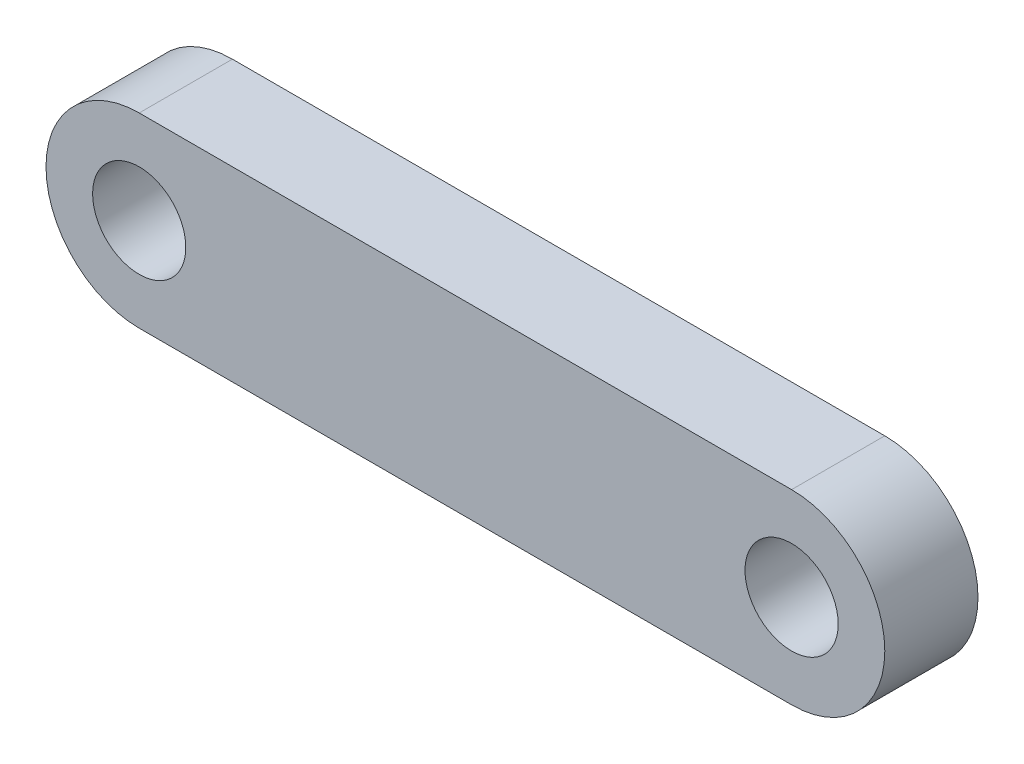
ISO-10303-21;
HEADER;
FILE_DESCRIPTION(('STEP AP214'),'2;1');
FILE_NAME('part.step','',(''),(''),'','','');
FILE_SCHEMA(('AUTOMOTIVE_DESIGN { 1 0 10303 214 1 1 1 1 }'));
ENDSEC;
DATA;
#1=APPLICATION_CONTEXT('core data for automotive mechanical design processes');
#2=APPLICATION_PROTOCOL_DEFINITION('international standard','automotive_design',2000,#1);
#3=PRODUCT_CONTEXT('',#1,'mechanical');
#4=PRODUCT('Part','Part','',(#3));
#5=PRODUCT_RELATED_PRODUCT_CATEGORY('part','',(#4));
#6=PRODUCT_DEFINITION_FORMATION('','',#4);
#7=PRODUCT_DEFINITION_CONTEXT('part definition',#1,'design');
#8=PRODUCT_DEFINITION('design','',#6,#7);
#9=PRODUCT_DEFINITION_SHAPE('','',#8);
#10=(LENGTH_UNIT() NAMED_UNIT(*) SI_UNIT(.MILLI.,.METRE.));
#11=(NAMED_UNIT(*) PLANE_ANGLE_UNIT() SI_UNIT($,.RADIAN.));
#12=(NAMED_UNIT(*) SI_UNIT($,.STERADIAN.) SOLID_ANGLE_UNIT());
#13=UNCERTAINTY_MEASURE_WITH_UNIT(LENGTH_MEASURE(1.E-05),#10,'distance_accuracy_value','');
#14=(GEOMETRIC_REPRESENTATION_CONTEXT(3) GLOBAL_UNCERTAINTY_ASSIGNED_CONTEXT((#13)) GLOBAL_UNIT_ASSIGNED_CONTEXT((#10,
#11,#12)) REPRESENTATION_CONTEXT('',''));
#15=CARTESIAN_POINT('',(0.,0.,0.));
#16=DIRECTION('',(0.,0.,1.));
#17=DIRECTION('',(1.,0.,0.));
#18=AXIS2_PLACEMENT_3D('',#15,#16,#17);
#19=CARTESIAN_POINT('',(-35.,0.,10.));
#20=DIRECTION('',(0.,0.,1.));
#21=DIRECTION('',(1.,0.,0.));
#22=AXIS2_PLACEMENT_3D('',#19,#20,#21);
#23=PLANE('',#22);
#24=CARTESIAN_POINT('',(35.,0.,10.));
#25=DIRECTION('',(0.,0.,1.));
#26=DIRECTION('',(1.,0.,0.));
#27=AXIS2_PLACEMENT_3D('',#24,#25,#26);
#28=CIRCLE('',#27,5.);
#29=CARTESIAN_POINT('',(40.,0.,10.));
#30=VERTEX_POINT('',#29);
#31=EDGE_CURVE('E100',#30,#30,#28,.T.);
#32=ORIENTED_EDGE('',*,*,#31,.F.);
#33=EDGE_LOOP('',(#32));
#34=FACE_BOUND('',#33,.T.);
#35=CARTESIAN_POINT('',(-35.,0.,10.));
#36=DIRECTION('',(0.,0.,1.));
#37=DIRECTION('',(1.,0.,0.));
#38=AXIS2_PLACEMENT_3D('',#35,#36,#37);
#39=CIRCLE('',#38,10.);
#40=CARTESIAN_POINT('',(-35.,10.,10.));
#41=VERTEX_POINT('',#40);
#42=CARTESIAN_POINT('',(-35.,-10.,10.));
#43=VERTEX_POINT('',#42);
#44=EDGE_CURVE('E85',#41,#43,#39,.T.);
#45=ORIENTED_EDGE('',*,*,#44,.T.);
#46=DIRECTION('',(1.,0.,0.));
#47=VECTOR('',#46,1.);
#48=CARTESIAN_POINT('',(-35.,-10.,10.));
#49=LINE('',#48,#47);
#50=CARTESIAN_POINT('',(35.,-10.,10.));
#51=VERTEX_POINT('',#50);
#52=EDGE_CURVE('E80',#43,#51,#49,.T.);
#53=ORIENTED_EDGE('',*,*,#52,.T.);
#54=CARTESIAN_POINT('',(35.,0.,10.));
#55=DIRECTION('',(0.,0.,1.));
#56=DIRECTION('',(1.,0.,0.));
#57=AXIS2_PLACEMENT_3D('',#54,#55,#56);
#58=CIRCLE('',#57,10.);
#59=CARTESIAN_POINT('',(35.,10.,10.));
#60=VERTEX_POINT('',#59);
#61=EDGE_CURVE('E83',#51,#60,#58,.T.);
#62=ORIENTED_EDGE('',*,*,#61,.T.);
#63=DIRECTION('',(-1.,0.,0.));
#64=VECTOR('',#63,1.);
#65=CARTESIAN_POINT('',(-35.,10.,10.));
#66=LINE('',#65,#64);
#67=EDGE_CURVE('E50',#60,#41,#66,.T.);
#68=ORIENTED_EDGE('',*,*,#67,.T.);
#69=EDGE_LOOP('',(#45,#53,#62,#68));
#70=FACE_BOUND('',#69,.T.);
#71=CARTESIAN_POINT('',(-35.,0.,10.));
#72=DIRECTION('',(0.,0.,1.));
#73=DIRECTION('',(-1.,0.,0.));
#74=AXIS2_PLACEMENT_3D('',#71,#72,#73);
#75=CIRCLE('',#74,5.);
#76=CARTESIAN_POINT('',(-40.,0.,10.));
#77=VERTEX_POINT('',#76);
#78=EDGE_CURVE('E115',#77,#77,#75,.T.);
#79=ORIENTED_EDGE('',*,*,#78,.F.);
#80=EDGE_LOOP('',(#79));
#81=FACE_BOUND('',#80,.T.);
#82=ADVANCED_FACE('F33',(#34,#70,#81),#23,.T.);
#83=CARTESIAN_POINT('',(-35.,0.,0.));
#84=DIRECTION('',(0.,0.,1.));
#85=DIRECTION('',(1.,0.,0.));
#86=AXIS2_PLACEMENT_3D('',#83,#84,#85);
#87=PLANE('',#86);
#88=CARTESIAN_POINT('',(-35.,0.,0.));
#89=DIRECTION('',(0.,0.,1.));
#90=DIRECTION('',(1.,0.,0.));
#91=AXIS2_PLACEMENT_3D('',#88,#89,#90);
#92=CIRCLE('',#91,10.);
#93=CARTESIAN_POINT('',(-35.,10.,0.));
#94=VERTEX_POINT('',#93);
#95=CARTESIAN_POINT('',(-35.,-10.,0.));
#96=VERTEX_POINT('',#95);
#97=EDGE_CURVE('E97',#94,#96,#92,.T.);
#98=ORIENTED_EDGE('',*,*,#97,.F.);
#99=DIRECTION('',(-1.,0.,0.));
#100=VECTOR('',#99,1.);
#101=CARTESIAN_POINT('',(-35.,10.,0.));
#102=LINE('',#101,#100);
#103=CARTESIAN_POINT('',(35.,10.,0.));
#104=VERTEX_POINT('',#103);
#105=EDGE_CURVE('E73',#104,#94,#102,.T.);
#106=ORIENTED_EDGE('',*,*,#105,.F.);
#107=CARTESIAN_POINT('',(35.,0.,0.));
#108=DIRECTION('',(0.,0.,1.));
#109=DIRECTION('',(1.,0.,0.));
#110=AXIS2_PLACEMENT_3D('',#107,#108,#109);
#111=CIRCLE('',#110,10.);
#112=CARTESIAN_POINT('',(35.,-10.,0.));
#113=VERTEX_POINT('',#112);
#114=EDGE_CURVE('E67',#113,#104,#111,.T.);
#115=ORIENTED_EDGE('',*,*,#114,.F.);
#116=DIRECTION('',(1.,0.,0.));
#117=VECTOR('',#116,1.);
#118=CARTESIAN_POINT('',(-35.,-10.,0.));
#119=LINE('',#118,#117);
#120=EDGE_CURVE('E89',#96,#113,#119,.T.);
#121=ORIENTED_EDGE('',*,*,#120,.F.);
#122=EDGE_LOOP('',(#98,#106,#115,#121));
#123=FACE_BOUND('',#122,.T.);
#124=CARTESIAN_POINT('',(35.,0.,0.));
#125=DIRECTION('',(0.,0.,1.));
#126=DIRECTION('',(1.,0.,0.));
#127=AXIS2_PLACEMENT_3D('',#124,#125,#126);
#128=CIRCLE('',#127,5.);
#129=CARTESIAN_POINT('',(40.,0.,0.));
#130=VERTEX_POINT('',#129);
#131=EDGE_CURVE('E112',#130,#130,#128,.T.);
#132=ORIENTED_EDGE('',*,*,#131,.T.);
#133=EDGE_LOOP('',(#132));
#134=FACE_BOUND('',#133,.T.);
#135=CARTESIAN_POINT('',(-35.,0.,0.));
#136=DIRECTION('',(0.,0.,1.));
#137=DIRECTION('',(-1.,0.,0.));
#138=AXIS2_PLACEMENT_3D('',#135,#136,#137);
#139=CIRCLE('',#138,5.);
#140=CARTESIAN_POINT('',(-40.,0.,0.));
#141=VERTEX_POINT('',#140);
#142=EDGE_CURVE('E118',#141,#141,#139,.T.);
#143=ORIENTED_EDGE('',*,*,#142,.T.);
#144=EDGE_LOOP('',(#143));
#145=FACE_BOUND('',#144,.T.);
#146=ADVANCED_FACE('F108',(#123,#134,#145),#87,.F.);
#147=CARTESIAN_POINT('',(-35.,0.,10.));
#148=DIRECTION('',(0.,0.,-1.));
#149=DIRECTION('',(-1.,0.,0.));
#150=AXIS2_PLACEMENT_3D('',#147,#148,#149);
#151=CYLINDRICAL_SURFACE('',#150,10.);
#152=ORIENTED_EDGE('',*,*,#97,.T.);
#153=DIRECTION('',(0.,0.,-1.));
#154=VECTOR('',#153,1.);
#155=CARTESIAN_POINT('',(-35.,-10.,10.));
#156=LINE('',#155,#154);
#157=EDGE_CURVE('E11',#43,#96,#156,.T.);
#158=ORIENTED_EDGE('',*,*,#157,.F.);
#159=ORIENTED_EDGE('',*,*,#44,.F.);
#160=DIRECTION('',(0.,0.,-1.));
#161=VECTOR('',#160,1.);
#162=CARTESIAN_POINT('',(-35.,10.,10.));
#163=LINE('',#162,#161);
#164=EDGE_CURVE('E93',#41,#94,#163,.T.);
#165=ORIENTED_EDGE('',*,*,#164,.T.);
#166=EDGE_LOOP('',(#152,#158,#159,#165));
#167=FACE_BOUND('',#166,.T.);
#168=ADVANCED_FACE('F35',(#167),#151,.T.);
#169=CARTESIAN_POINT('',(-35.,-10.,10.));
#170=DIRECTION('',(0.,1.,0.));
#171=DIRECTION('',(-1.,0.,0.));
#172=AXIS2_PLACEMENT_3D('',#169,#170,#171);
#173=PLANE('',#172);
#174=ORIENTED_EDGE('',*,*,#120,.T.);
#175=DIRECTION('',(0.,0.,-1.));
#176=VECTOR('',#175,1.);
#177=CARTESIAN_POINT('',(35.,-10.,10.));
#178=LINE('',#177,#176);
#179=EDGE_CURVE('E42',#51,#113,#178,.T.);
#180=ORIENTED_EDGE('',*,*,#179,.F.);
#181=ORIENTED_EDGE('',*,*,#52,.F.);
#182=ORIENTED_EDGE('',*,*,#157,.T.);
#183=EDGE_LOOP('',(#174,#180,#181,#182));
#184=FACE_BOUND('',#183,.T.);
#185=ADVANCED_FACE('F88',(#184),#173,.F.);
#186=CARTESIAN_POINT('',(35.,0.,10.));
#187=DIRECTION('',(0.,0.,-1.));
#188=DIRECTION('',(-1.,0.,0.));
#189=AXIS2_PLACEMENT_3D('',#186,#187,#188);
#190=CYLINDRICAL_SURFACE('',#189,10.);
#191=ORIENTED_EDGE('',*,*,#114,.T.);
#192=DIRECTION('',(0.,0.,-1.));
#193=VECTOR('',#192,1.);
#194=CARTESIAN_POINT('',(35.,10.,10.));
#195=LINE('',#194,#193);
#196=EDGE_CURVE('E90',#60,#104,#195,.T.);
#197=ORIENTED_EDGE('',*,*,#196,.F.);
#198=ORIENTED_EDGE('',*,*,#61,.F.);
#199=ORIENTED_EDGE('',*,*,#179,.T.);
#200=EDGE_LOOP('',(#191,#197,#198,#199));
#201=FACE_BOUND('',#200,.T.);
#202=ADVANCED_FACE('F91',(#201),#190,.T.);
#203=CARTESIAN_POINT('',(-35.,10.,10.));
#204=DIRECTION('',(0.,-1.,0.));
#205=DIRECTION('',(1.,0.,0.));
#206=AXIS2_PLACEMENT_3D('',#203,#204,#205);
#207=PLANE('',#206);
#208=ORIENTED_EDGE('',*,*,#105,.T.);
#209=ORIENTED_EDGE('',*,*,#164,.F.);
#210=ORIENTED_EDGE('',*,*,#67,.F.);
#211=ORIENTED_EDGE('',*,*,#196,.T.);
#212=EDGE_LOOP('',(#208,#209,#210,#211));
#213=FACE_BOUND('',#212,.T.);
#214=ADVANCED_FACE('F105',(#213),#207,.F.);
#215=CARTESIAN_POINT('',(35.,0.,10.));
#216=DIRECTION('',(0.,0.,-1.));
#217=DIRECTION('',(-1.,0.,0.));
#218=AXIS2_PLACEMENT_3D('',#215,#216,#217);
#219=CYLINDRICAL_SURFACE('',#218,5.);
#220=ORIENTED_EDGE('',*,*,#31,.T.);
#221=EDGE_LOOP('',(#220));
#222=FACE_BOUND('',#221,.T.);
#223=ORIENTED_EDGE('',*,*,#131,.F.);
#224=EDGE_LOOP('',(#223));
#225=FACE_BOUND('',#224,.T.);
#226=ADVANCED_FACE('F135',(#222,#225),#219,.F.);
#227=CARTESIAN_POINT('',(-35.,0.,10.));
#228=DIRECTION('',(0.,0.,-1.));
#229=DIRECTION('',(-1.,0.,0.));
#230=AXIS2_PLACEMENT_3D('',#227,#228,#229);
#231=CYLINDRICAL_SURFACE('',#230,5.);
#232=ORIENTED_EDGE('',*,*,#78,.T.);
#233=EDGE_LOOP('',(#232));
#234=FACE_BOUND('',#233,.T.);
#235=ORIENTED_EDGE('',*,*,#142,.F.);
#236=EDGE_LOOP('',(#235));
#237=FACE_BOUND('',#236,.T.);
#238=ADVANCED_FACE('F124',(#234,#237),#231,.F.);
#239=CLOSED_SHELL('',(#82,#146,#168,#185,#202,#214,#226,#238));
#240=MANIFOLD_SOLID_BREP('B2',#239);
#241=ADVANCED_BREP_SHAPE_REPRESENTATION('',(#18,#240),#14);
#242=SHAPE_DEFINITION_REPRESENTATION(#9,#241);
ENDSEC;
END-ISO-10303-21;
